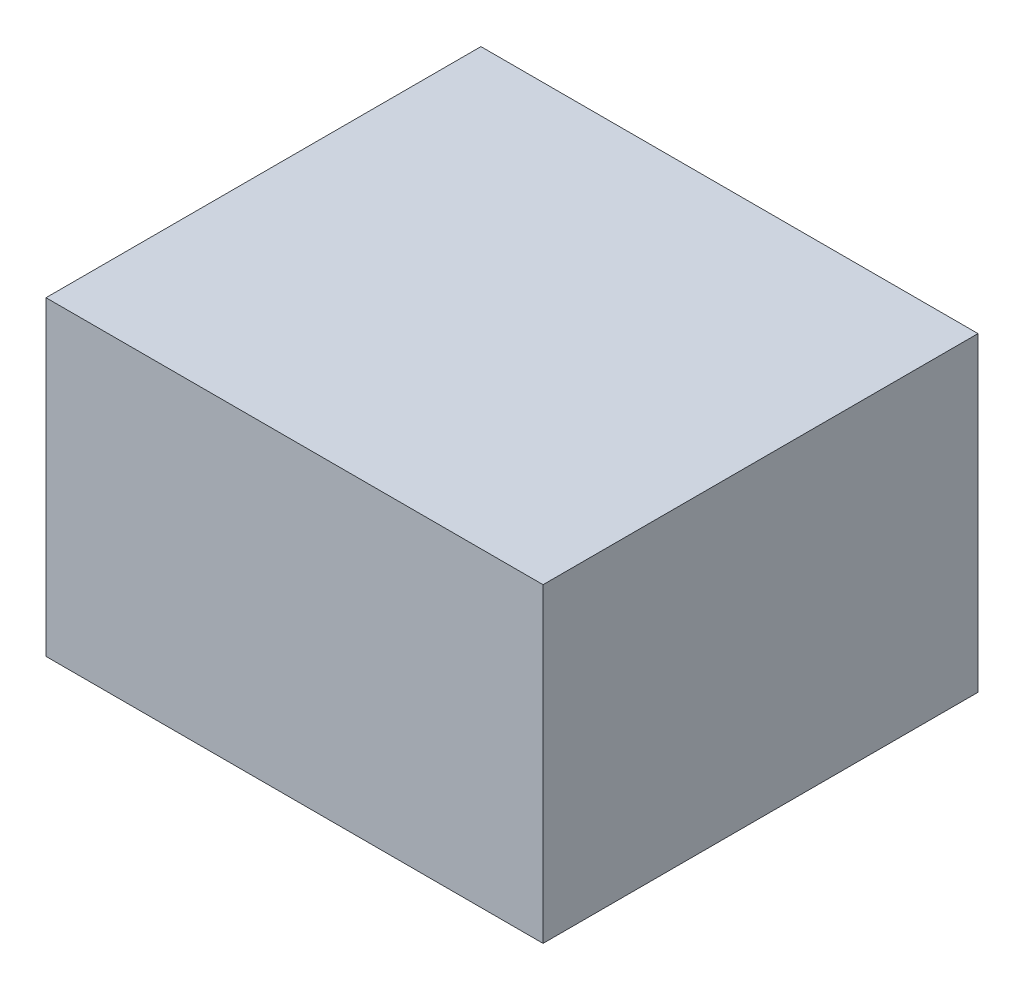
ISO-10303-21;
HEADER;
FILE_DESCRIPTION(('STEP AP214'),'2;1');
FILE_NAME('part.step','',(''),(''),'','','');
FILE_SCHEMA(('AUTOMOTIVE_DESIGN { 1 0 10303 214 1 1 1 1 }'));
ENDSEC;
DATA;
#1=APPLICATION_CONTEXT('core data for automotive mechanical design processes');
#2=APPLICATION_PROTOCOL_DEFINITION('international standard','automotive_design',2000,#1);
#3=PRODUCT_CONTEXT('',#1,'mechanical');
#4=PRODUCT('Part','Part','',(#3));
#5=PRODUCT_RELATED_PRODUCT_CATEGORY('part','',(#4));
#6=PRODUCT_DEFINITION_FORMATION('','',#4);
#7=PRODUCT_DEFINITION_CONTEXT('part definition',#1,'design');
#8=PRODUCT_DEFINITION('design','',#6,#7);
#9=PRODUCT_DEFINITION_SHAPE('','',#8);
#10=(LENGTH_UNIT() NAMED_UNIT(*) SI_UNIT(.MILLI.,.METRE.));
#11=(NAMED_UNIT(*) PLANE_ANGLE_UNIT() SI_UNIT($,.RADIAN.));
#12=(NAMED_UNIT(*) SI_UNIT($,.STERADIAN.) SOLID_ANGLE_UNIT());
#13=UNCERTAINTY_MEASURE_WITH_UNIT(LENGTH_MEASURE(1.E-05),#10,'distance_accuracy_value','');
#14=(GEOMETRIC_REPRESENTATION_CONTEXT(3) GLOBAL_UNCERTAINTY_ASSIGNED_CONTEXT((#13)) GLOBAL_UNIT_ASSIGNED_CONTEXT((#10,
#11,#12)) REPRESENTATION_CONTEXT('',''));
#15=CARTESIAN_POINT('',(0.,0.,0.));
#16=DIRECTION('',(0.,0.,1.));
#17=DIRECTION('',(1.,0.,0.));
#18=AXIS2_PLACEMENT_3D('',#15,#16,#17);
#19=CARTESIAN_POINT('',(-200.,-205.,-1465.));
#20=DIRECTION('',(1.,0.,0.));
#21=DIRECTION('',(0.,0.,-1.));
#22=AXIS2_PLACEMENT_3D('',#19,#20,#21);
#23=PLANE('',#22);
#24=DIRECTION('',(0.,-1.,0.));
#25=VECTOR('',#24,1.);
#26=CARTESIAN_POINT('',(-200.,-205.,-1815.));
#27=LINE('',#26,#25);
#28=CARTESIAN_POINT('',(-200.,44.9999999999999,-1815.));
#29=VERTEX_POINT('',#28);
#30=CARTESIAN_POINT('',(-200.,-205.,-1815.));
#31=VERTEX_POINT('',#30);
#32=EDGE_CURVE('E105',#29,#31,#27,.T.);
#33=ORIENTED_EDGE('',*,*,#32,.T.);
#34=DIRECTION('',(0.,0.,-1.));
#35=VECTOR('',#34,1.);
#36=CARTESIAN_POINT('',(-200.,-205.,-1465.));
#37=LINE('',#36,#35);
#38=CARTESIAN_POINT('',(-200.,-205.,-1465.));
#39=VERTEX_POINT('',#38);
#40=EDGE_CURVE('E11',#39,#31,#37,.T.);
#41=ORIENTED_EDGE('',*,*,#40,.F.);
#42=DIRECTION('',(0.,-1.,0.));
#43=VECTOR('',#42,1.);
#44=CARTESIAN_POINT('',(-200.,-205.,-1465.));
#45=LINE('',#44,#43);
#46=CARTESIAN_POINT('',(-200.,44.9999999999999,-1465.));
#47=VERTEX_POINT('',#46);
#48=EDGE_CURVE('E89',#47,#39,#45,.T.);
#49=ORIENTED_EDGE('',*,*,#48,.F.);
#50=DIRECTION('',(0.,0.,-1.));
#51=VECTOR('',#50,1.);
#52=CARTESIAN_POINT('',(-200.,44.9999999999999,-1465.));
#53=LINE('',#52,#51);
#54=EDGE_CURVE('E98',#47,#29,#53,.T.);
#55=ORIENTED_EDGE('',*,*,#54,.T.);
#56=EDGE_LOOP('',(#33,#41,#49,#55));
#57=FACE_BOUND('',#56,.T.);
#58=ADVANCED_FACE('F39',(#57),#23,.F.);
#59=CARTESIAN_POINT('',(-200.,-205.,-1465.));
#60=DIRECTION('',(0.,1.,0.));
#61=DIRECTION('',(0.,0.,1.));
#62=AXIS2_PLACEMENT_3D('',#59,#60,#61);
#63=PLANE('',#62);
#64=DIRECTION('',(1.,0.,0.));
#65=VECTOR('',#64,1.);
#66=CARTESIAN_POINT('',(-200.,-205.,-1815.));
#67=LINE('',#66,#65);
#68=CARTESIAN_POINT('',(200.,-205.,-1815.));
#69=VERTEX_POINT('',#68);
#70=EDGE_CURVE('E94',#31,#69,#67,.T.);
#71=ORIENTED_EDGE('',*,*,#70,.T.);
#72=DIRECTION('',(0.,0.,-1.));
#73=VECTOR('',#72,1.);
#74=CARTESIAN_POINT('',(200.,-205.,-1465.));
#75=LINE('',#74,#73);
#76=CARTESIAN_POINT('',(200.,-205.,-1465.));
#77=VERTEX_POINT('',#76);
#78=EDGE_CURVE('E50',#77,#69,#75,.T.);
#79=ORIENTED_EDGE('',*,*,#78,.F.);
#80=DIRECTION('',(1.,0.,0.));
#81=VECTOR('',#80,1.);
#82=CARTESIAN_POINT('',(-200.,-205.,-1465.));
#83=LINE('',#82,#81);
#84=EDGE_CURVE('E83',#39,#77,#83,.T.);
#85=ORIENTED_EDGE('',*,*,#84,.F.);
#86=ORIENTED_EDGE('',*,*,#40,.T.);
#87=EDGE_LOOP('',(#71,#79,#85,#86));
#88=FACE_BOUND('',#87,.T.);
#89=ADVANCED_FACE('F91',(#88),#63,.F.);
#90=CARTESIAN_POINT('',(200.,-205.,-1465.));
#91=DIRECTION('',(-1.,0.,0.));
#92=DIRECTION('',(0.,0.,1.));
#93=AXIS2_PLACEMENT_3D('',#90,#91,#92);
#94=PLANE('',#93);
#95=DIRECTION('',(0.,1.,0.));
#96=VECTOR('',#95,1.);
#97=CARTESIAN_POINT('',(200.,-205.,-1815.));
#98=LINE('',#97,#96);
#99=CARTESIAN_POINT('',(200.,44.9999999999999,-1815.));
#100=VERTEX_POINT('',#99);
#101=EDGE_CURVE('E75',#69,#100,#98,.T.);
#102=ORIENTED_EDGE('',*,*,#101,.T.);
#103=DIRECTION('',(0.,0.,-1.));
#104=VECTOR('',#103,1.);
#105=CARTESIAN_POINT('',(200.,44.9999999999999,-1465.));
#106=LINE('',#105,#104);
#107=CARTESIAN_POINT('',(200.,44.9999999999999,-1465.));
#108=VERTEX_POINT('',#107);
#109=EDGE_CURVE('E92',#108,#100,#106,.T.);
#110=ORIENTED_EDGE('',*,*,#109,.F.);
#111=DIRECTION('',(0.,1.,0.));
#112=VECTOR('',#111,1.);
#113=CARTESIAN_POINT('',(200.,-205.,-1465.));
#114=LINE('',#113,#112);
#115=EDGE_CURVE('E86',#77,#108,#114,.T.);
#116=ORIENTED_EDGE('',*,*,#115,.F.);
#117=ORIENTED_EDGE('',*,*,#78,.T.);
#118=EDGE_LOOP('',(#102,#110,#116,#117));
#119=FACE_BOUND('',#118,.T.);
#120=ADVANCED_FACE('F96',(#119),#94,.F.);
#121=CARTESIAN_POINT('',(-200.,44.9999999999999,-1465.));
#122=DIRECTION('',(0.,-1.,0.));
#123=DIRECTION('',(0.,0.,-1.));
#124=AXIS2_PLACEMENT_3D('',#121,#122,#123);
#125=PLANE('',#124);
#126=DIRECTION('',(-1.,0.,0.));
#127=VECTOR('',#126,1.);
#128=CARTESIAN_POINT('',(-200.,44.9999999999999,-1815.));
#129=LINE('',#128,#127);
#130=EDGE_CURVE('E79',#100,#29,#129,.T.);
#131=ORIENTED_EDGE('',*,*,#130,.T.);
#132=ORIENTED_EDGE('',*,*,#54,.F.);
#133=DIRECTION('',(-1.,0.,0.));
#134=VECTOR('',#133,1.);
#135=CARTESIAN_POINT('',(-200.,44.9999999999999,-1465.));
#136=LINE('',#135,#134);
#137=EDGE_CURVE('E54',#108,#47,#136,.T.);
#138=ORIENTED_EDGE('',*,*,#137,.F.);
#139=ORIENTED_EDGE('',*,*,#109,.T.);
#140=EDGE_LOOP('',(#131,#132,#138,#139));
#141=FACE_BOUND('',#140,.T.);
#142=ADVANCED_FACE('F108',(#141),#125,.F.);
#143=CARTESIAN_POINT('',(0.,0.,-1465.));
#144=DIRECTION('',(0.,0.,-1.));
#145=DIRECTION('',(-1.,0.,0.));
#146=AXIS2_PLACEMENT_3D('',#143,#144,#145);
#147=PLANE('',#146);
#148=ORIENTED_EDGE('',*,*,#48,.T.);
#149=ORIENTED_EDGE('',*,*,#84,.T.);
#150=ORIENTED_EDGE('',*,*,#115,.T.);
#151=ORIENTED_EDGE('',*,*,#137,.T.);
#152=EDGE_LOOP('',(#148,#149,#150,#151));
#153=FACE_BOUND('',#152,.T.);
#154=ADVANCED_FACE('F88',(#153),#147,.F.);
#155=CARTESIAN_POINT('',(0.,0.,-1815.));
#156=DIRECTION('',(0.,0.,-1.));
#157=DIRECTION('',(-1.,0.,0.));
#158=AXIS2_PLACEMENT_3D('',#155,#156,#157);
#159=PLANE('',#158);
#160=ORIENTED_EDGE('',*,*,#32,.F.);
#161=ORIENTED_EDGE('',*,*,#130,.F.);
#162=ORIENTED_EDGE('',*,*,#101,.F.);
#163=ORIENTED_EDGE('',*,*,#70,.F.);
#164=EDGE_LOOP('',(#160,#161,#162,#163));
#165=FACE_BOUND('',#164,.T.);
#166=ADVANCED_FACE('F115',(#165),#159,.T.);
#167=CLOSED_SHELL('',(#58,#89,#120,#142,#154,#166));
#168=MANIFOLD_SOLID_BREP('B2',#167);
#169=ADVANCED_BREP_SHAPE_REPRESENTATION('',(#18,#168),#14);
#170=SHAPE_DEFINITION_REPRESENTATION(#9,#169);
ENDSEC;
END-ISO-10303-21;
